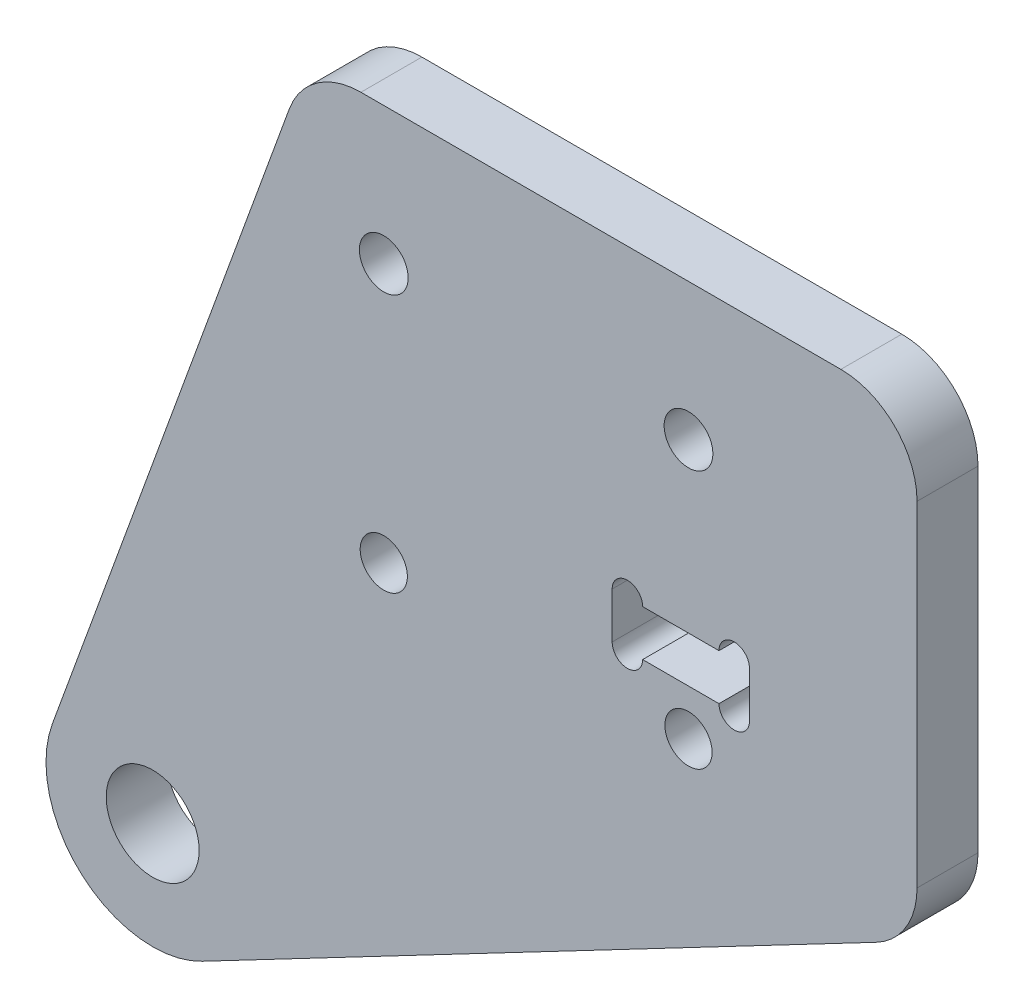
ISO-10303-21;
HEADER;
FILE_DESCRIPTION(('STEP AP214'),'2;1');
FILE_NAME('part.step','',(''),(''),'','','');
FILE_SCHEMA(('AUTOMOTIVE_DESIGN { 1 0 10303 214 1 1 1 1 }'));
ENDSEC;
DATA;
#1=APPLICATION_CONTEXT('core data for automotive mechanical design processes');
#2=APPLICATION_PROTOCOL_DEFINITION('international standard','automotive_design',2000,#1);
#3=PRODUCT_CONTEXT('',#1,'mechanical');
#4=PRODUCT('Part','Part','',(#3));
#5=PRODUCT_RELATED_PRODUCT_CATEGORY('part','',(#4));
#6=PRODUCT_DEFINITION_FORMATION('','',#4);
#7=PRODUCT_DEFINITION_CONTEXT('part definition',#1,'design');
#8=PRODUCT_DEFINITION('design','',#6,#7);
#9=PRODUCT_DEFINITION_SHAPE('','',#8);
#10=(LENGTH_UNIT() NAMED_UNIT(*) SI_UNIT(.MILLI.,.METRE.));
#11=(NAMED_UNIT(*) PLANE_ANGLE_UNIT() SI_UNIT($,.RADIAN.));
#12=(NAMED_UNIT(*) SI_UNIT($,.STERADIAN.) SOLID_ANGLE_UNIT());
#13=UNCERTAINTY_MEASURE_WITH_UNIT(LENGTH_MEASURE(1.E-05),#10,'distance_accuracy_value','');
#14=(GEOMETRIC_REPRESENTATION_CONTEXT(3) GLOBAL_UNCERTAINTY_ASSIGNED_CONTEXT((#13)) GLOBAL_UNIT_ASSIGNED_CONTEXT((#10,
#11,#12)) REPRESENTATION_CONTEXT('',''));
#15=CARTESIAN_POINT('',(0.,0.,0.));
#16=DIRECTION('',(0.,0.,1.));
#17=DIRECTION('',(1.,0.,0.));
#18=AXIS2_PLACEMENT_3D('',#15,#16,#17);
#19=CARTESIAN_POINT('',(0.,0.,4.));
#20=DIRECTION('',(0.,0.,-1.));
#21=DIRECTION('',(-1.,0.,0.));
#22=AXIS2_PLACEMENT_3D('',#19,#20,#21);
#23=PLANE('',#22);
#24=DIRECTION('',(-1.,0.,0.));
#25=VECTOR('',#24,1.);
#26=CARTESIAN_POINT('',(0.,-23.,4.));
#27=LINE('',#26,#25);
#28=CARTESIAN_POINT('',(27.,-23.,4.));
#29=VERTEX_POINT('',#28);
#30=CARTESIAN_POINT('',(21.99,-23.,4.));
#31=VERTEX_POINT('',#30);
#32=EDGE_CURVE('E223',#29,#31,#27,.T.);
#33=ORIENTED_EDGE('',*,*,#32,.T.);
#34=CARTESIAN_POINT('',(20.99,-23.,4.));
#35=DIRECTION('',(0.,0.,-1.));
#36=DIRECTION('',(-1.,0.,0.));
#37=AXIS2_PLACEMENT_3D('',#34,#35,#36);
#38=CIRCLE('',#37,1.);
#39=CARTESIAN_POINT('',(19.99,-23.,4.));
#40=VERTEX_POINT('',#39);
#41=EDGE_CURVE('E226',#31,#40,#38,.T.);
#42=ORIENTED_EDGE('',*,*,#41,.T.);
#43=DIRECTION('',(0.,1.,0.));
#44=VECTOR('',#43,1.);
#45=CARTESIAN_POINT('',(19.99,0.,4.));
#46=LINE('',#45,#44);
#47=CARTESIAN_POINT('',(19.99,-19.99,4.));
#48=VERTEX_POINT('',#47);
#49=EDGE_CURVE('E208',#40,#48,#46,.T.);
#50=ORIENTED_EDGE('',*,*,#49,.T.);
#51=CARTESIAN_POINT('',(20.99,-19.99,4.));
#52=DIRECTION('',(0.,0.,-1.));
#53=DIRECTION('',(-1.,0.,0.));
#54=AXIS2_PLACEMENT_3D('',#51,#52,#53);
#55=CIRCLE('',#54,1.);
#56=CARTESIAN_POINT('',(21.99,-19.99,4.));
#57=VERTEX_POINT('',#56);
#58=EDGE_CURVE('E155',#48,#57,#55,.T.);
#59=ORIENTED_EDGE('',*,*,#58,.T.);
#60=DIRECTION('',(1.,0.,0.));
#61=VECTOR('',#60,1.);
#62=CARTESIAN_POINT('',(0.,-19.99,4.));
#63=LINE('',#62,#61);
#64=CARTESIAN_POINT('',(27.,-19.99,4.));
#65=VERTEX_POINT('',#64);
#66=EDGE_CURVE('E211',#57,#65,#63,.T.);
#67=ORIENTED_EDGE('',*,*,#66,.T.);
#68=CARTESIAN_POINT('',(28.,-19.99,4.));
#69=DIRECTION('',(0.,0.,-1.));
#70=DIRECTION('',(-1.,0.,0.));
#71=AXIS2_PLACEMENT_3D('',#68,#69,#70);
#72=CIRCLE('',#71,1.);
#73=CARTESIAN_POINT('',(29.,-19.99,4.));
#74=VERTEX_POINT('',#73);
#75=EDGE_CURVE('E214',#65,#74,#72,.T.);
#76=ORIENTED_EDGE('',*,*,#75,.T.);
#77=DIRECTION('',(0.,-1.,0.));
#78=VECTOR('',#77,1.);
#79=CARTESIAN_POINT('',(29.,0.,4.));
#80=LINE('',#79,#78);
#81=CARTESIAN_POINT('',(29.,-23.,4.));
#82=VERTEX_POINT('',#81);
#83=EDGE_CURVE('E217',#74,#82,#80,.T.);
#84=ORIENTED_EDGE('',*,*,#83,.T.);
#85=CARTESIAN_POINT('',(28.,-23.,4.));
#86=DIRECTION('',(0.,0.,-1.));
#87=DIRECTION('',(-1.,0.,0.));
#88=AXIS2_PLACEMENT_3D('',#85,#86,#87);
#89=CIRCLE('',#88,1.);
#90=EDGE_CURVE('E220',#82,#29,#89,.T.);
#91=ORIENTED_EDGE('',*,*,#90,.T.);
#92=EDGE_LOOP('',(#33,#42,#50,#59,#67,#76,#84,#91));
#93=FACE_BOUND('',#92,.T.);
#94=CARTESIAN_POINT('',(5.,-26.,4.));
#95=DIRECTION('',(0.,0.,-1.));
#96=DIRECTION('',(-1.,0.,0.));
#97=AXIS2_PLACEMENT_3D('',#94,#95,#96);
#98=CIRCLE('',#97,1.55);
#99=CARTESIAN_POINT('',(3.45,-26.,4.));
#100=VERTEX_POINT('',#99);
#101=EDGE_CURVE('E205',#100,#100,#98,.T.);
#102=ORIENTED_EDGE('',*,*,#101,.T.);
#103=EDGE_LOOP('',(#102));
#104=FACE_BOUND('',#103,.T.);
#105=CARTESIAN_POINT('',(25.,-26.,4.));
#106=DIRECTION('',(0.,0.,-1.));
#107=DIRECTION('',(-1.,0.,0.));
#108=AXIS2_PLACEMENT_3D('',#105,#106,#107);
#109=CIRCLE('',#108,1.55);
#110=CARTESIAN_POINT('',(23.45,-26.,4.));
#111=VERTEX_POINT('',#110);
#112=EDGE_CURVE('E202',#111,#111,#109,.T.);
#113=ORIENTED_EDGE('',*,*,#112,.T.);
#114=EDGE_LOOP('',(#113));
#115=FACE_BOUND('',#114,.T.);
#116=CARTESIAN_POINT('',(-10.1682716690462,-48.4037276067266,4.));
#117=DIRECTION('',(0.,0.,1.));
#118=DIRECTION('',(1.,0.,0.));
#119=AXIS2_PLACEMENT_3D('',#116,#117,#118);
#120=CIRCLE('',#119,3.05);
#121=CARTESIAN_POINT('',(-7.11827166904619,-48.4037276067266,4.));
#122=VERTEX_POINT('',#121);
#123=EDGE_CURVE('E229',#122,#122,#120,.T.);
#124=ORIENTED_EDGE('',*,*,#123,.F.);
#125=EDGE_LOOP('',(#124));
#126=FACE_BOUND('',#125,.T.);
#127=DIRECTION('',(0.885619723467944,0.464411138329565,0.));
#128=VECTOR('',#127,1.);
#129=CARTESIAN_POINT('',(40.,-30.,4.));
#130=LINE('',#129,#128);
#131=CARTESIAN_POINT('',(-6.91739370073924,-54.6030656710022,4.));
#132=VERTEX_POINT('',#131);
#133=CARTESIAN_POINT('',(37.3220556916478,-31.4042902745605,4.));
#134=VERTEX_POINT('',#133);
#135=EDGE_CURVE('E248',#132,#134,#130,.T.);
#136=ORIENTED_EDGE('',*,*,#135,.T.);
#137=CARTESIAN_POINT('',(35.,-26.9761916572208,4.));
#138=DIRECTION('',(0.,0.,-1.));
#139=DIRECTION('',(-1.,0.,0.));
#140=AXIS2_PLACEMENT_3D('',#137,#138,#139);
#141=CIRCLE('',#140,5.);
#142=CARTESIAN_POINT('',(40.,-26.9761916572208,4.));
#143=VERTEX_POINT('',#142);
#144=EDGE_CURVE('E297',#134,#143,#141,.F.);
#145=ORIENTED_EDGE('',*,*,#144,.T.);
#146=DIRECTION('',(0.,1.,0.));
#147=VECTOR('',#146,1.);
#148=CARTESIAN_POINT('',(40.,0.,4.));
#149=LINE('',#148,#147);
#150=CARTESIAN_POINT('',(40.,-5.,4.));
#151=VERTEX_POINT('',#150);
#152=EDGE_CURVE('E252',#143,#151,#149,.T.);
#153=ORIENTED_EDGE('',*,*,#152,.T.);
#154=CARTESIAN_POINT('',(35.,-5.,4.));
#155=DIRECTION('',(0.,0.,-1.));
#156=DIRECTION('',(-1.,0.,0.));
#157=AXIS2_PLACEMENT_3D('',#154,#155,#156);
#158=CIRCLE('',#157,5.);
#159=CARTESIAN_POINT('',(35.,0.,4.));
#160=VERTEX_POINT('',#159);
#161=EDGE_CURVE('E295',#151,#160,#158,.F.);
#162=ORIENTED_EDGE('',*,*,#161,.T.);
#163=DIRECTION('',(-1.,0.,0.));
#164=VECTOR('',#163,1.);
#165=CARTESIAN_POINT('',(0.,0.,4.));
#166=LINE('',#165,#164);
#167=CARTESIAN_POINT('',(3.50103769104857,0.,4.));
#168=VERTEX_POINT('',#167);
#169=EDGE_CURVE('E255',#160,#168,#166,.T.);
#170=ORIENTED_EDGE('',*,*,#169,.T.);
#171=CARTESIAN_POINT('',(3.50103769104857,-4.99999999999999,4.));
#172=DIRECTION('',(0.,0.,-1.));
#173=DIRECTION('',(-1.,0.,0.));
#174=AXIS2_PLACEMENT_3D('',#171,#172,#173);
#175=CIRCLE('',#174,5.);
#176=CARTESIAN_POINT('',(-1.19742541288099,-3.28989928337167,4.));
#177=VERTEX_POINT('',#176);
#178=EDGE_CURVE('E293',#168,#177,#175,.F.);
#179=ORIENTED_EDGE('',*,*,#178,.T.);
#180=DIRECTION('',(-0.342020143325666,-0.939692620785909,0.));
#181=VECTOR('',#180,1.);
#182=CARTESIAN_POINT('',(-22.9301247587705,-63.,4.));
#183=LINE('',#182,#181);
#184=CARTESIAN_POINT('',(-16.7461200145476,-46.009586603447,4.));
#185=VERTEX_POINT('',#184);
#186=EDGE_CURVE('E246',#177,#185,#183,.T.);
#187=ORIENTED_EDGE('',*,*,#186,.T.);
#188=CARTESIAN_POINT('',(-10.1682716690462,-48.4037276067266,4.));
#189=DIRECTION('',(0.,0.,-1.));
#190=DIRECTION('',(-1.,0.,0.));
#191=AXIS2_PLACEMENT_3D('',#188,#189,#190);
#192=CIRCLE('',#191,7.);
#193=EDGE_CURVE('E276',#185,#132,#192,.F.);
#194=ORIENTED_EDGE('',*,*,#193,.T.);
#195=EDGE_LOOP('',(#136,#145,#153,#162,#170,#179,#187,#194));
#196=FACE_BOUND('',#195,.T.);
#197=CARTESIAN_POINT('',(5.,-9.,4.));
#198=DIRECTION('',(0.,0.,1.));
#199=DIRECTION('',(1.,0.,0.));
#200=AXIS2_PLACEMENT_3D('',#197,#198,#199);
#201=CIRCLE('',#200,1.6);
#202=CARTESIAN_POINT('',(6.6,-9.,4.));
#203=VERTEX_POINT('',#202);
#204=EDGE_CURVE('E240',#203,#203,#201,.T.);
#205=ORIENTED_EDGE('',*,*,#204,.F.);
#206=EDGE_LOOP('',(#205));
#207=FACE_BOUND('',#206,.T.);
#208=CARTESIAN_POINT('',(25.,-9.,4.));
#209=DIRECTION('',(0.,0.,1.));
#210=DIRECTION('',(1.,0.,0.));
#211=AXIS2_PLACEMENT_3D('',#208,#209,#210);
#212=CIRCLE('',#211,1.6);
#213=CARTESIAN_POINT('',(26.6,-9.,4.));
#214=VERTEX_POINT('',#213);
#215=EDGE_CURVE('E233',#214,#214,#212,.T.);
#216=ORIENTED_EDGE('',*,*,#215,.F.);
#217=EDGE_LOOP('',(#216));
#218=FACE_BOUND('',#217,.T.);
#219=ADVANCED_FACE('F36',(#93,#104,#115,#126,#196,#207,#218),#23,.F.);
#220=CARTESIAN_POINT('',(0.,0.,0.));
#221=DIRECTION('',(0.,0.,-1.));
#222=DIRECTION('',(-1.,0.,0.));
#223=AXIS2_PLACEMENT_3D('',#220,#221,#222);
#224=PLANE('',#223);
#225=CARTESIAN_POINT('',(20.99,-23.,0.));
#226=DIRECTION('',(0.,0.,-1.));
#227=DIRECTION('',(-1.,0.,0.));
#228=AXIS2_PLACEMENT_3D('',#225,#226,#227);
#229=CIRCLE('',#228,1.);
#230=CARTESIAN_POINT('',(21.99,-23.,0.));
#231=VERTEX_POINT('',#230);
#232=CARTESIAN_POINT('',(19.99,-23.,0.));
#233=VERTEX_POINT('',#232);
#234=EDGE_CURVE('E59',#231,#233,#229,.T.);
#235=ORIENTED_EDGE('',*,*,#234,.F.);
#236=DIRECTION('',(-1.,0.,0.));
#237=VECTOR('',#236,1.);
#238=CARTESIAN_POINT('',(21.99,-23.,0.));
#239=LINE('',#238,#237);
#240=CARTESIAN_POINT('',(27.,-23.,0.));
#241=VERTEX_POINT('',#240);
#242=EDGE_CURVE('E183',#241,#231,#239,.T.);
#243=ORIENTED_EDGE('',*,*,#242,.F.);
#244=CARTESIAN_POINT('',(28.,-23.,0.));
#245=DIRECTION('',(0.,0.,-1.));
#246=DIRECTION('',(-1.,0.,0.));
#247=AXIS2_PLACEMENT_3D('',#244,#245,#246);
#248=CIRCLE('',#247,1.);
#249=CARTESIAN_POINT('',(29.,-23.,0.));
#250=VERTEX_POINT('',#249);
#251=EDGE_CURVE('E180',#250,#241,#248,.T.);
#252=ORIENTED_EDGE('',*,*,#251,.F.);
#253=DIRECTION('',(0.,-1.,0.));
#254=VECTOR('',#253,1.);
#255=CARTESIAN_POINT('',(29.,-23.,0.));
#256=LINE('',#255,#254);
#257=CARTESIAN_POINT('',(29.,-19.99,0.));
#258=VERTEX_POINT('',#257);
#259=EDGE_CURVE('E177',#258,#250,#256,.T.);
#260=ORIENTED_EDGE('',*,*,#259,.F.);
#261=CARTESIAN_POINT('',(28.,-19.99,0.));
#262=DIRECTION('',(0.,0.,-1.));
#263=DIRECTION('',(-1.,0.,0.));
#264=AXIS2_PLACEMENT_3D('',#261,#262,#263);
#265=CIRCLE('',#264,1.);
#266=CARTESIAN_POINT('',(27.,-19.99,0.));
#267=VERTEX_POINT('',#266);
#268=EDGE_CURVE('E171',#267,#258,#265,.T.);
#269=ORIENTED_EDGE('',*,*,#268,.F.);
#270=DIRECTION('',(1.,0.,0.));
#271=VECTOR('',#270,1.);
#272=CARTESIAN_POINT('',(21.99,-19.99,0.));
#273=LINE('',#272,#271);
#274=CARTESIAN_POINT('',(21.99,-19.99,0.));
#275=VERTEX_POINT('',#274);
#276=EDGE_CURVE('E169',#275,#267,#273,.T.);
#277=ORIENTED_EDGE('',*,*,#276,.F.);
#278=CARTESIAN_POINT('',(20.99,-19.99,0.));
#279=DIRECTION('',(0.,0.,-1.));
#280=DIRECTION('',(-1.,0.,0.));
#281=AXIS2_PLACEMENT_3D('',#278,#279,#280);
#282=CIRCLE('',#281,1.);
#283=CARTESIAN_POINT('',(19.99,-19.99,0.));
#284=VERTEX_POINT('',#283);
#285=EDGE_CURVE('E152',#284,#275,#282,.T.);
#286=ORIENTED_EDGE('',*,*,#285,.F.);
#287=DIRECTION('',(0.,1.,0.));
#288=VECTOR('',#287,1.);
#289=CARTESIAN_POINT('',(19.99,-23.,0.));
#290=LINE('',#289,#288);
#291=EDGE_CURVE('E161',#233,#284,#290,.T.);
#292=ORIENTED_EDGE('',*,*,#291,.F.);
#293=EDGE_LOOP('',(#235,#243,#252,#260,#269,#277,#286,#292));
#294=FACE_BOUND('',#293,.T.);
#295=CARTESIAN_POINT('',(5.,-26.,0.));
#296=DIRECTION('',(0.,0.,-1.));
#297=DIRECTION('',(-1.,0.,0.));
#298=AXIS2_PLACEMENT_3D('',#295,#296,#297);
#299=CIRCLE('',#298,1.55);
#300=CARTESIAN_POINT('',(3.45,-26.,0.));
#301=VERTEX_POINT('',#300);
#302=EDGE_CURVE('E188',#301,#301,#299,.T.);
#303=ORIENTED_EDGE('',*,*,#302,.F.);
#304=EDGE_LOOP('',(#303));
#305=FACE_BOUND('',#304,.T.);
#306=CARTESIAN_POINT('',(25.,-26.,0.));
#307=DIRECTION('',(0.,0.,-1.));
#308=DIRECTION('',(-1.,0.,0.));
#309=AXIS2_PLACEMENT_3D('',#306,#307,#308);
#310=CIRCLE('',#309,1.55);
#311=CARTESIAN_POINT('',(23.45,-26.,0.));
#312=VERTEX_POINT('',#311);
#313=EDGE_CURVE('E199',#312,#312,#310,.T.);
#314=ORIENTED_EDGE('',*,*,#313,.F.);
#315=EDGE_LOOP('',(#314));
#316=FACE_BOUND('',#315,.T.);
#317=CARTESIAN_POINT('',(-10.1682716690462,-48.4037276067266,0.));
#318=DIRECTION('',(0.,0.,-1.));
#319=DIRECTION('',(-1.,0.,0.));
#320=AXIS2_PLACEMENT_3D('',#317,#318,#319);
#321=CIRCLE('',#320,3.05);
#322=CARTESIAN_POINT('',(-13.2182716690462,-48.4037276067266,0.));
#323=VERTEX_POINT('',#322);
#324=EDGE_CURVE('E232',#323,#323,#321,.T.);
#325=ORIENTED_EDGE('',*,*,#324,.F.);
#326=EDGE_LOOP('',(#325));
#327=FACE_BOUND('',#326,.T.);
#328=CARTESIAN_POINT('',(5.,-9.,0.));
#329=DIRECTION('',(0.,0.,1.));
#330=DIRECTION('',(1.,0.,0.));
#331=AXIS2_PLACEMENT_3D('',#328,#329,#330);
#332=CIRCLE('',#331,1.6);
#333=CARTESIAN_POINT('',(6.6,-9.,0.));
#334=VERTEX_POINT('',#333);
#335=EDGE_CURVE('E236',#334,#334,#332,.T.);
#336=ORIENTED_EDGE('',*,*,#335,.T.);
#337=EDGE_LOOP('',(#336));
#338=FACE_BOUND('',#337,.T.);
#339=DIRECTION('',(0.,1.,0.));
#340=VECTOR('',#339,1.);
#341=CARTESIAN_POINT('',(40.,0.,0.));
#342=LINE('',#341,#340);
#343=CARTESIAN_POINT('',(40.,-26.9761916572208,0.));
#344=VERTEX_POINT('',#343);
#345=CARTESIAN_POINT('',(40.,-5.,0.));
#346=VERTEX_POINT('',#345);
#347=EDGE_CURVE('E263',#344,#346,#342,.T.);
#348=ORIENTED_EDGE('',*,*,#347,.F.);
#349=CARTESIAN_POINT('',(35.,-26.9761916572208,0.));
#350=DIRECTION('',(0.,0.,-1.));
#351=DIRECTION('',(-1.,0.,0.));
#352=AXIS2_PLACEMENT_3D('',#349,#350,#351);
#353=CIRCLE('',#352,5.);
#354=CARTESIAN_POINT('',(37.3220556916478,-31.4042902745605,0.));
#355=VERTEX_POINT('',#354);
#356=EDGE_CURVE('E289',#344,#355,#353,.T.);
#357=ORIENTED_EDGE('',*,*,#356,.T.);
#358=DIRECTION('',(0.885619723467944,0.464411138329565,0.));
#359=VECTOR('',#358,1.);
#360=CARTESIAN_POINT('',(40.,-30.,0.));
#361=LINE('',#360,#359);
#362=CARTESIAN_POINT('',(-6.91739370073924,-54.6030656710022,0.));
#363=VERTEX_POINT('',#362);
#364=EDGE_CURVE('E260',#363,#355,#361,.T.);
#365=ORIENTED_EDGE('',*,*,#364,.F.);
#366=CARTESIAN_POINT('',(-10.1682716690462,-48.4037276067266,0.));
#367=DIRECTION('',(0.,0.,-1.));
#368=DIRECTION('',(-1.,0.,0.));
#369=AXIS2_PLACEMENT_3D('',#366,#367,#368);
#370=CIRCLE('',#369,7.);
#371=CARTESIAN_POINT('',(-16.7461200145476,-46.009586603447,0.));
#372=VERTEX_POINT('',#371);
#373=EDGE_CURVE('E270',#363,#372,#370,.T.);
#374=ORIENTED_EDGE('',*,*,#373,.T.);
#375=DIRECTION('',(-0.342020143325666,-0.939692620785909,0.));
#376=VECTOR('',#375,1.);
#377=CARTESIAN_POINT('',(-22.9301247587705,-63.,0.));
#378=LINE('',#377,#376);
#379=CARTESIAN_POINT('',(-1.19742541288099,-3.28989928337167,0.));
#380=VERTEX_POINT('',#379);
#381=EDGE_CURVE('E243',#380,#372,#378,.T.);
#382=ORIENTED_EDGE('',*,*,#381,.F.);
#383=CARTESIAN_POINT('',(3.50103769104857,-4.99999999999999,0.));
#384=DIRECTION('',(0.,0.,-1.));
#385=DIRECTION('',(-1.,0.,0.));
#386=AXIS2_PLACEMENT_3D('',#383,#384,#385);
#387=CIRCLE('',#386,5.);
#388=CARTESIAN_POINT('',(3.50103769104857,0.,0.));
#389=VERTEX_POINT('',#388);
#390=EDGE_CURVE('E285',#380,#389,#387,.T.);
#391=ORIENTED_EDGE('',*,*,#390,.T.);
#392=DIRECTION('',(-1.,0.,0.));
#393=VECTOR('',#392,1.);
#394=CARTESIAN_POINT('',(0.,0.,0.));
#395=LINE('',#394,#393);
#396=CARTESIAN_POINT('',(35.,0.,0.));
#397=VERTEX_POINT('',#396);
#398=EDGE_CURVE('E249',#397,#389,#395,.T.);
#399=ORIENTED_EDGE('',*,*,#398,.F.);
#400=CARTESIAN_POINT('',(35.,-5.,0.));
#401=DIRECTION('',(0.,0.,-1.));
#402=DIRECTION('',(-1.,0.,0.));
#403=AXIS2_PLACEMENT_3D('',#400,#401,#402);
#404=CIRCLE('',#403,5.);
#405=EDGE_CURVE('E287',#397,#346,#404,.T.);
#406=ORIENTED_EDGE('',*,*,#405,.T.);
#407=EDGE_LOOP('',(#348,#357,#365,#374,#382,#391,#399,#406));
#408=FACE_BOUND('',#407,.T.);
#409=CARTESIAN_POINT('',(25.,-9.,0.));
#410=DIRECTION('',(0.,0.,1.));
#411=DIRECTION('',(1.,0.,0.));
#412=AXIS2_PLACEMENT_3D('',#409,#410,#411);
#413=CIRCLE('',#412,1.6);
#414=CARTESIAN_POINT('',(26.6,-9.,0.));
#415=VERTEX_POINT('',#414);
#416=EDGE_CURVE('E237',#415,#415,#413,.T.);
#417=ORIENTED_EDGE('',*,*,#416,.T.);
#418=EDGE_LOOP('',(#417));
#419=FACE_BOUND('',#418,.T.);
#420=ADVANCED_FACE('F165',(#294,#305,#316,#327,#338,#408,#419),#224,.T.);
#421=CARTESIAN_POINT('',(-22.9301247587705,-63.,4.));
#422=DIRECTION('',(0.93969262078591,-0.342020143325666,0.));
#423=DIRECTION('',(0.342020143325666,0.93969262078591,0.));
#424=AXIS2_PLACEMENT_3D('',#421,#422,#423);
#425=PLANE('',#424);
#426=ORIENTED_EDGE('',*,*,#186,.F.);
#427=DIRECTION('',(0.,0.,-1.));
#428=VECTOR('',#427,1.);
#429=CARTESIAN_POINT('',(-1.19742541288098,-3.28989928337166,4.));
#430=LINE('',#429,#428);
#431=EDGE_CURVE('E11',#177,#380,#430,.T.);
#432=ORIENTED_EDGE('',*,*,#431,.T.);
#433=ORIENTED_EDGE('',*,*,#381,.T.);
#434=DIRECTION('',(0.,0.,-1.));
#435=VECTOR('',#434,1.);
#436=CARTESIAN_POINT('',(-16.7461200145475,-46.009586603447,4.));
#437=LINE('',#436,#435);
#438=EDGE_CURVE('E273',#372,#185,#437,.F.);
#439=ORIENTED_EDGE('',*,*,#438,.T.);
#440=EDGE_LOOP('',(#426,#432,#433,#439));
#441=FACE_BOUND('',#440,.T.);
#442=ADVANCED_FACE('F318',(#441),#425,.F.);
#443=CARTESIAN_POINT('',(40.,-30.,4.));
#444=DIRECTION('',(-0.464411138329565,0.885619723467944,0.));
#445=DIRECTION('',(-0.885619723467944,-0.464411138329565,0.));
#446=AXIS2_PLACEMENT_3D('',#443,#444,#445);
#447=PLANE('',#446);
#448=ORIENTED_EDGE('',*,*,#364,.T.);
#449=DIRECTION('',(0.,0.,-1.));
#450=VECTOR('',#449,1.);
#451=CARTESIAN_POINT('',(37.3220556916478,-31.4042902745605,4.));
#452=LINE('',#451,#450);
#453=EDGE_CURVE('E291',#355,#134,#452,.F.);
#454=ORIENTED_EDGE('',*,*,#453,.T.);
#455=ORIENTED_EDGE('',*,*,#135,.F.);
#456=DIRECTION('',(0.,0.,-1.));
#457=VECTOR('',#456,1.);
#458=CARTESIAN_POINT('',(-6.91739370073923,-54.6030656710022,4.));
#459=LINE('',#458,#457);
#460=EDGE_CURVE('E258',#132,#363,#459,.T.);
#461=ORIENTED_EDGE('',*,*,#460,.T.);
#462=EDGE_LOOP('',(#448,#454,#455,#461));
#463=FACE_BOUND('',#462,.T.);
#464=ADVANCED_FACE('F334',(#463),#447,.F.);
#465=CARTESIAN_POINT('',(40.,0.,4.));
#466=DIRECTION('',(-1.,0.,0.));
#467=DIRECTION('',(0.,-1.,0.));
#468=AXIS2_PLACEMENT_3D('',#465,#466,#467);
#469=PLANE('',#468);
#470=ORIENTED_EDGE('',*,*,#152,.F.);
#471=DIRECTION('',(0.,0.,-1.));
#472=VECTOR('',#471,1.);
#473=CARTESIAN_POINT('',(40.,-26.9761916572208,4.));
#474=LINE('',#473,#472);
#475=EDGE_CURVE('E282',#143,#344,#474,.T.);
#476=ORIENTED_EDGE('',*,*,#475,.T.);
#477=ORIENTED_EDGE('',*,*,#347,.T.);
#478=DIRECTION('',(0.,0.,-1.));
#479=VECTOR('',#478,1.);
#480=CARTESIAN_POINT('',(40.,-5.,4.));
#481=LINE('',#480,#479);
#482=EDGE_CURVE('E278',#346,#151,#481,.F.);
#483=ORIENTED_EDGE('',*,*,#482,.T.);
#484=EDGE_LOOP('',(#470,#476,#477,#483));
#485=FACE_BOUND('',#484,.T.);
#486=ADVANCED_FACE('F328',(#485),#469,.F.);
#487=CARTESIAN_POINT('',(0.,0.,4.));
#488=DIRECTION('',(0.,-1.,0.));
#489=DIRECTION('',(0.,0.,-1.));
#490=AXIS2_PLACEMENT_3D('',#487,#488,#489);
#491=PLANE('',#490);
#492=ORIENTED_EDGE('',*,*,#169,.F.);
#493=DIRECTION('',(0.,0.,-1.));
#494=VECTOR('',#493,1.);
#495=CARTESIAN_POINT('',(35.,0.,4.));
#496=LINE('',#495,#494);
#497=EDGE_CURVE('E44',#160,#397,#496,.T.);
#498=ORIENTED_EDGE('',*,*,#497,.T.);
#499=ORIENTED_EDGE('',*,*,#398,.T.);
#500=DIRECTION('',(0.,0.,-1.));
#501=VECTOR('',#500,1.);
#502=CARTESIAN_POINT('',(3.50103769104857,0.,4.));
#503=LINE('',#502,#501);
#504=EDGE_CURVE('E299',#389,#168,#503,.F.);
#505=ORIENTED_EDGE('',*,*,#504,.T.);
#506=EDGE_LOOP('',(#492,#498,#499,#505));
#507=FACE_BOUND('',#506,.T.);
#508=ADVANCED_FACE('F305',(#507),#491,.F.);
#509=CARTESIAN_POINT('',(5.,-9.,4.));
#510=DIRECTION('',(0.,0.,-1.));
#511=DIRECTION('',(-1.,0.,0.));
#512=AXIS2_PLACEMENT_3D('',#509,#510,#511);
#513=CYLINDRICAL_SURFACE('',#512,1.6);
#514=ORIENTED_EDGE('',*,*,#204,.T.);
#515=EDGE_LOOP('',(#514));
#516=FACE_BOUND('',#515,.T.);
#517=ORIENTED_EDGE('',*,*,#335,.F.);
#518=EDGE_LOOP('',(#517));
#519=FACE_BOUND('',#518,.T.);
#520=ADVANCED_FACE('F350',(#516,#519),#513,.F.);
#521=CARTESIAN_POINT('',(25.,-9.,4.));
#522=DIRECTION('',(0.,0.,-1.));
#523=DIRECTION('',(-1.,0.,0.));
#524=AXIS2_PLACEMENT_3D('',#521,#522,#523);
#525=CYLINDRICAL_SURFACE('',#524,1.6);
#526=ORIENTED_EDGE('',*,*,#215,.T.);
#527=EDGE_LOOP('',(#526));
#528=FACE_BOUND('',#527,.T.);
#529=ORIENTED_EDGE('',*,*,#416,.F.);
#530=EDGE_LOOP('',(#529));
#531=FACE_BOUND('',#530,.T.);
#532=ADVANCED_FACE('F342',(#528,#531),#525,.F.);
#533=CARTESIAN_POINT('',(-10.1682716690462,-48.4037276067266,4.));
#534=DIRECTION('',(0.,0.,-1.));
#535=DIRECTION('',(-1.,0.,0.));
#536=AXIS2_PLACEMENT_3D('',#533,#534,#535);
#537=CYLINDRICAL_SURFACE('',#536,7.);
#538=ORIENTED_EDGE('',*,*,#193,.F.);
#539=ORIENTED_EDGE('',*,*,#438,.F.);
#540=ORIENTED_EDGE('',*,*,#373,.F.);
#541=ORIENTED_EDGE('',*,*,#460,.F.);
#542=EDGE_LOOP('',(#538,#539,#540,#541));
#543=FACE_BOUND('',#542,.T.);
#544=ADVANCED_FACE('F339',(#543),#537,.T.);
#545=CARTESIAN_POINT('',(-10.1682716690462,-48.4037276067266,-1.5));
#546=DIRECTION('',(0.,0.,1.));
#547=DIRECTION('',(1.,0.,0.));
#548=AXIS2_PLACEMENT_3D('',#545,#546,#547);
#549=CYLINDRICAL_SURFACE('',#548,3.05);
#550=ORIENTED_EDGE('',*,*,#324,.T.);
#551=EDGE_LOOP('',(#550));
#552=FACE_BOUND('',#551,.T.);
#553=ORIENTED_EDGE('',*,*,#123,.T.);
#554=EDGE_LOOP('',(#553));
#555=FACE_BOUND('',#554,.T.);
#556=ADVANCED_FACE('F341',(#552,#555),#549,.F.);
#557=CARTESIAN_POINT('',(35.,-26.9761916572208,4.));
#558=DIRECTION('',(0.,0.,-1.));
#559=DIRECTION('',(-1.,0.,0.));
#560=AXIS2_PLACEMENT_3D('',#557,#558,#559);
#561=CYLINDRICAL_SURFACE('',#560,5.);
#562=ORIENTED_EDGE('',*,*,#144,.F.);
#563=ORIENTED_EDGE('',*,*,#453,.F.);
#564=ORIENTED_EDGE('',*,*,#356,.F.);
#565=ORIENTED_EDGE('',*,*,#475,.F.);
#566=EDGE_LOOP('',(#562,#563,#564,#565));
#567=FACE_BOUND('',#566,.T.);
#568=ADVANCED_FACE('F337',(#567),#561,.T.);
#569=CARTESIAN_POINT('',(35.,-5.,4.));
#570=DIRECTION('',(0.,0.,-1.));
#571=DIRECTION('',(-1.,0.,0.));
#572=AXIS2_PLACEMENT_3D('',#569,#570,#571);
#573=CYLINDRICAL_SURFACE('',#572,5.);
#574=ORIENTED_EDGE('',*,*,#161,.F.);
#575=ORIENTED_EDGE('',*,*,#482,.F.);
#576=ORIENTED_EDGE('',*,*,#405,.F.);
#577=ORIENTED_EDGE('',*,*,#497,.F.);
#578=EDGE_LOOP('',(#574,#575,#576,#577));
#579=FACE_BOUND('',#578,.T.);
#580=ADVANCED_FACE('F326',(#579),#573,.T.);
#581=CARTESIAN_POINT('',(3.50103769104857,-4.99999999999999,4.));
#582=DIRECTION('',(0.,0.,-1.));
#583=DIRECTION('',(-1.,0.,0.));
#584=AXIS2_PLACEMENT_3D('',#581,#582,#583);
#585=CYLINDRICAL_SURFACE('',#584,5.);
#586=ORIENTED_EDGE('',*,*,#178,.F.);
#587=ORIENTED_EDGE('',*,*,#504,.F.);
#588=ORIENTED_EDGE('',*,*,#390,.F.);
#589=ORIENTED_EDGE('',*,*,#431,.F.);
#590=EDGE_LOOP('',(#586,#587,#588,#589));
#591=FACE_BOUND('',#590,.T.);
#592=ADVANCED_FACE('F38',(#591),#585,.T.);
#593=CARTESIAN_POINT('',(25.,-26.,5.));
#594=DIRECTION('',(0.,0.,-1.));
#595=DIRECTION('',(-1.,0.,0.));
#596=AXIS2_PLACEMENT_3D('',#593,#594,#595);
#597=CYLINDRICAL_SURFACE('',#596,1.55);
#598=ORIENTED_EDGE('',*,*,#313,.T.);
#599=EDGE_LOOP('',(#598));
#600=FACE_BOUND('',#599,.T.);
#601=ORIENTED_EDGE('',*,*,#112,.F.);
#602=EDGE_LOOP('',(#601));
#603=FACE_BOUND('',#602,.T.);
#604=ADVANCED_FACE('F425',(#600,#603),#597,.F.);
#605=CARTESIAN_POINT('',(5.,-26.,5.));
#606=DIRECTION('',(0.,0.,-1.));
#607=DIRECTION('',(-1.,0.,0.));
#608=AXIS2_PLACEMENT_3D('',#605,#606,#607);
#609=CYLINDRICAL_SURFACE('',#608,1.55);
#610=ORIENTED_EDGE('',*,*,#302,.T.);
#611=EDGE_LOOP('',(#610));
#612=FACE_BOUND('',#611,.T.);
#613=ORIENTED_EDGE('',*,*,#101,.F.);
#614=EDGE_LOOP('',(#613));
#615=FACE_BOUND('',#614,.T.);
#616=ADVANCED_FACE('F431',(#612,#615),#609,.F.);
#617=CARTESIAN_POINT('',(20.99,-23.,5.));
#618=DIRECTION('',(0.,0.,-1.));
#619=DIRECTION('',(-1.,0.,0.));
#620=AXIS2_PLACEMENT_3D('',#617,#618,#619);
#621=CYLINDRICAL_SURFACE('',#620,1.);
#622=DIRECTION('',(0.,0.,-1.));
#623=VECTOR('',#622,1.);
#624=CARTESIAN_POINT('',(21.99,-23.,5.));
#625=LINE('',#624,#623);
#626=EDGE_CURVE('E186',#31,#231,#625,.T.);
#627=ORIENTED_EDGE('',*,*,#626,.T.);
#628=ORIENTED_EDGE('',*,*,#234,.T.);
#629=DIRECTION('',(0.,0.,-1.));
#630=VECTOR('',#629,1.);
#631=CARTESIAN_POINT('',(19.99,-23.,5.));
#632=LINE('',#631,#630);
#633=EDGE_CURVE('E158',#40,#233,#632,.T.);
#634=ORIENTED_EDGE('',*,*,#633,.F.);
#635=ORIENTED_EDGE('',*,*,#41,.F.);
#636=EDGE_LOOP('',(#627,#628,#634,#635));
#637=FACE_BOUND('',#636,.T.);
#638=ADVANCED_FACE('F439',(#637),#621,.F.);
#639=CARTESIAN_POINT('',(21.99,-23.,5.));
#640=DIRECTION('',(0.,-1.,0.));
#641=DIRECTION('',(0.,0.,-1.));
#642=AXIS2_PLACEMENT_3D('',#639,#640,#641);
#643=PLANE('',#642);
#644=DIRECTION('',(0.,0.,-1.));
#645=VECTOR('',#644,1.);
#646=CARTESIAN_POINT('',(27.,-23.,5.));
#647=LINE('',#646,#645);
#648=EDGE_CURVE('E189',#29,#241,#647,.T.);
#649=ORIENTED_EDGE('',*,*,#648,.T.);
#650=ORIENTED_EDGE('',*,*,#242,.T.);
#651=ORIENTED_EDGE('',*,*,#626,.F.);
#652=ORIENTED_EDGE('',*,*,#32,.F.);
#653=EDGE_LOOP('',(#649,#650,#651,#652));
#654=FACE_BOUND('',#653,.T.);
#655=ADVANCED_FACE('F447',(#654),#643,.F.);
#656=CARTESIAN_POINT('',(28.,-23.,5.));
#657=DIRECTION('',(0.,0.,-1.));
#658=DIRECTION('',(-1.,0.,0.));
#659=AXIS2_PLACEMENT_3D('',#656,#657,#658);
#660=CYLINDRICAL_SURFACE('',#659,1.);
#661=DIRECTION('',(0.,0.,-1.));
#662=VECTOR('',#661,1.);
#663=CARTESIAN_POINT('',(29.,-23.,5.));
#664=LINE('',#663,#662);
#665=EDGE_CURVE('E191',#82,#250,#664,.T.);
#666=ORIENTED_EDGE('',*,*,#665,.T.);
#667=ORIENTED_EDGE('',*,*,#251,.T.);
#668=ORIENTED_EDGE('',*,*,#648,.F.);
#669=ORIENTED_EDGE('',*,*,#90,.F.);
#670=EDGE_LOOP('',(#666,#667,#668,#669));
#671=FACE_BOUND('',#670,.T.);
#672=ADVANCED_FACE('F454',(#671),#660,.F.);
#673=CARTESIAN_POINT('',(29.,-23.,5.));
#674=DIRECTION('',(1.,0.,0.));
#675=DIRECTION('',(0.,0.,-1.));
#676=AXIS2_PLACEMENT_3D('',#673,#674,#675);
#677=PLANE('',#676);
#678=DIRECTION('',(0.,0.,-1.));
#679=VECTOR('',#678,1.);
#680=CARTESIAN_POINT('',(29.,-19.99,5.));
#681=LINE('',#680,#679);
#682=EDGE_CURVE('E193',#74,#258,#681,.T.);
#683=ORIENTED_EDGE('',*,*,#682,.T.);
#684=ORIENTED_EDGE('',*,*,#259,.T.);
#685=ORIENTED_EDGE('',*,*,#665,.F.);
#686=ORIENTED_EDGE('',*,*,#83,.F.);
#687=EDGE_LOOP('',(#683,#684,#685,#686));
#688=FACE_BOUND('',#687,.T.);
#689=ADVANCED_FACE('F462',(#688),#677,.F.);
#690=CARTESIAN_POINT('',(28.,-19.99,5.));
#691=DIRECTION('',(0.,0.,-1.));
#692=DIRECTION('',(-1.,0.,0.));
#693=AXIS2_PLACEMENT_3D('',#690,#691,#692);
#694=CYLINDRICAL_SURFACE('',#693,1.);
#695=DIRECTION('',(0.,0.,-1.));
#696=VECTOR('',#695,1.);
#697=CARTESIAN_POINT('',(27.,-19.99,5.));
#698=LINE('',#697,#696);
#699=EDGE_CURVE('E195',#65,#267,#698,.T.);
#700=ORIENTED_EDGE('',*,*,#699,.T.);
#701=ORIENTED_EDGE('',*,*,#268,.T.);
#702=ORIENTED_EDGE('',*,*,#682,.F.);
#703=ORIENTED_EDGE('',*,*,#75,.F.);
#704=EDGE_LOOP('',(#700,#701,#702,#703));
#705=FACE_BOUND('',#704,.T.);
#706=ADVANCED_FACE('F470',(#705),#694,.F.);
#707=CARTESIAN_POINT('',(21.99,-19.99,5.));
#708=DIRECTION('',(0.,1.,0.));
#709=DIRECTION('',(-1.,0.,0.));
#710=AXIS2_PLACEMENT_3D('',#707,#708,#709);
#711=PLANE('',#710);
#712=DIRECTION('',(0.,0.,-1.));
#713=VECTOR('',#712,1.);
#714=CARTESIAN_POINT('',(21.99,-19.99,5.));
#715=LINE('',#714,#713);
#716=EDGE_CURVE('E157',#57,#275,#715,.T.);
#717=ORIENTED_EDGE('',*,*,#716,.T.);
#718=ORIENTED_EDGE('',*,*,#276,.T.);
#719=ORIENTED_EDGE('',*,*,#699,.F.);
#720=ORIENTED_EDGE('',*,*,#66,.F.);
#721=EDGE_LOOP('',(#717,#718,#719,#720));
#722=FACE_BOUND('',#721,.T.);
#723=ADVANCED_FACE('F478',(#722),#711,.F.);
#724=CARTESIAN_POINT('',(20.99,-19.99,5.));
#725=DIRECTION('',(0.,0.,-1.));
#726=DIRECTION('',(-1.,0.,0.));
#727=AXIS2_PLACEMENT_3D('',#724,#725,#726);
#728=CYLINDRICAL_SURFACE('',#727,1.);
#729=DIRECTION('',(0.,0.,-1.));
#730=VECTOR('',#729,1.);
#731=CARTESIAN_POINT('',(19.99,-19.99,5.));
#732=LINE('',#731,#730);
#733=EDGE_CURVE('E51',#48,#284,#732,.T.);
#734=ORIENTED_EDGE('',*,*,#733,.T.);
#735=ORIENTED_EDGE('',*,*,#285,.T.);
#736=ORIENTED_EDGE('',*,*,#716,.F.);
#737=ORIENTED_EDGE('',*,*,#58,.F.);
#738=EDGE_LOOP('',(#734,#735,#736,#737));
#739=FACE_BOUND('',#738,.T.);
#740=ADVANCED_FACE('F149',(#739),#728,.F.);
#741=CARTESIAN_POINT('',(19.99,-23.,5.));
#742=DIRECTION('',(-1.,0.,0.));
#743=DIRECTION('',(0.,0.,1.));
#744=AXIS2_PLACEMENT_3D('',#741,#742,#743);
#745=PLANE('',#744);
#746=ORIENTED_EDGE('',*,*,#633,.T.);
#747=ORIENTED_EDGE('',*,*,#291,.T.);
#748=ORIENTED_EDGE('',*,*,#733,.F.);
#749=ORIENTED_EDGE('',*,*,#49,.F.);
#750=EDGE_LOOP('',(#746,#747,#748,#749));
#751=FACE_BOUND('',#750,.T.);
#752=ADVANCED_FACE('F162',(#751),#745,.F.);
#753=CLOSED_SHELL('',(#219,#420,#442,#464,#486,#508,#520,#532,#544,#556,#568,#580,#592,#604,
#616,#638,#655,#672,#689,#706,#723,#740,#752));
#754=MANIFOLD_SOLID_BREP('B2',#753);
#755=ADVANCED_BREP_SHAPE_REPRESENTATION('',(#18,#754),#14);
#756=SHAPE_DEFINITION_REPRESENTATION(#9,#755);
ENDSEC;
END-ISO-10303-21;
